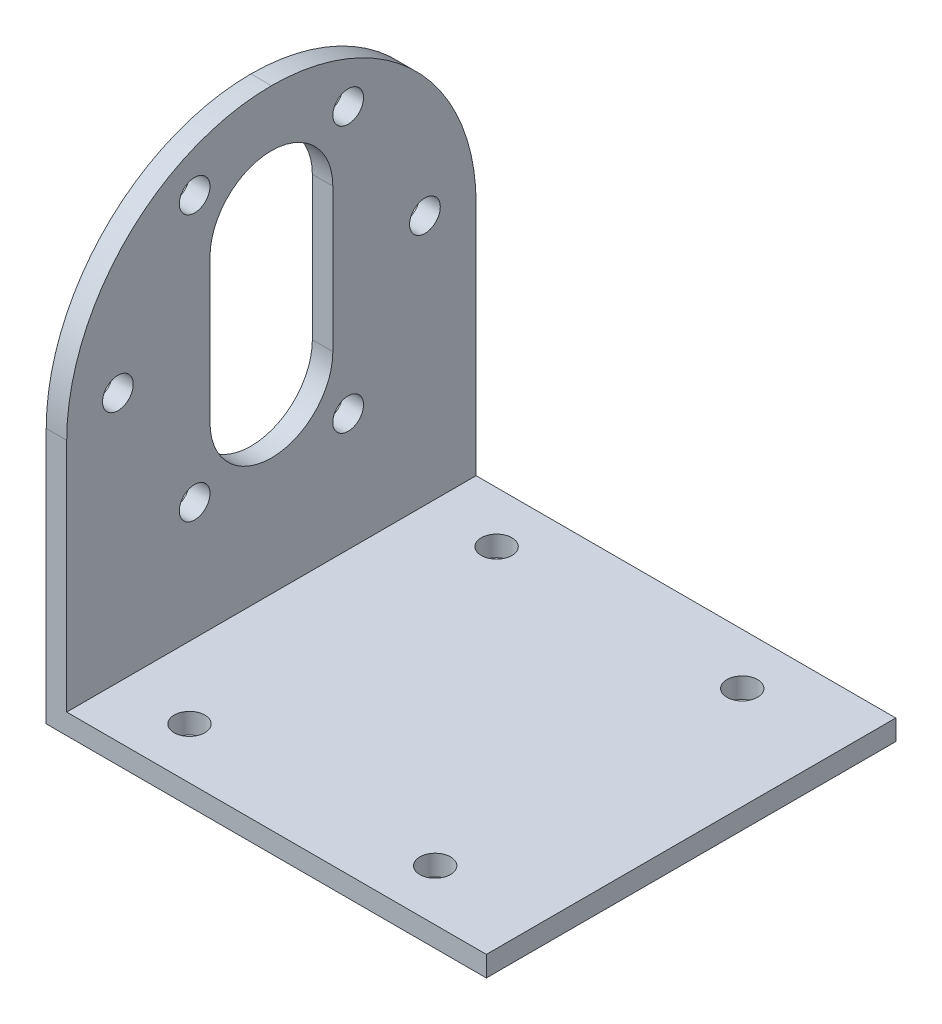
ISO-10303-21;
HEADER;
FILE_DESCRIPTION(('STEP AP214'),'2;1');
FILE_NAME('part.step','',(''),(''),'','','');
FILE_SCHEMA(('AUTOMOTIVE_DESIGN { 1 0 10303 214 1 1 1 1 }'));
ENDSEC;
DATA;
#1=APPLICATION_CONTEXT('core data for automotive mechanical design processes');
#2=APPLICATION_PROTOCOL_DEFINITION('international standard','automotive_design',2000,#1);
#3=PRODUCT_CONTEXT('',#1,'mechanical');
#4=PRODUCT('Part','Part','',(#3));
#5=PRODUCT_RELATED_PRODUCT_CATEGORY('part','',(#4));
#6=PRODUCT_DEFINITION_FORMATION('','',#4);
#7=PRODUCT_DEFINITION_CONTEXT('part definition',#1,'design');
#8=PRODUCT_DEFINITION('design','',#6,#7);
#9=PRODUCT_DEFINITION_SHAPE('','',#8);
#10=(LENGTH_UNIT() NAMED_UNIT(*) SI_UNIT(.MILLI.,.METRE.));
#11=(NAMED_UNIT(*) PLANE_ANGLE_UNIT() SI_UNIT($,.RADIAN.));
#12=(NAMED_UNIT(*) SI_UNIT($,.STERADIAN.) SOLID_ANGLE_UNIT());
#13=UNCERTAINTY_MEASURE_WITH_UNIT(LENGTH_MEASURE(1.E-05),#10,'distance_accuracy_value','');
#14=(GEOMETRIC_REPRESENTATION_CONTEXT(3) GLOBAL_UNCERTAINTY_ASSIGNED_CONTEXT((#13)) GLOBAL_UNIT_ASSIGNED_CONTEXT((#10,
#11,#12)) REPRESENTATION_CONTEXT('',''));
#15=CARTESIAN_POINT('',(0.,0.,0.));
#16=DIRECTION('',(0.,0.,1.));
#17=DIRECTION('',(1.,0.,0.));
#18=AXIS2_PLACEMENT_3D('',#15,#16,#17);
#19=CARTESIAN_POINT('',(0.,-2.,40.));
#20=DIRECTION('',(0.,1.,0.));
#21=DIRECTION('',(0.,0.,1.));
#22=AXIS2_PLACEMENT_3D('',#19,#20,#21);
#23=PLANE('',#22);
#24=CARTESIAN_POINT('',(6.99999999999999,-2.,5.));
#25=DIRECTION('',(0.,1.,0.));
#26=DIRECTION('',(0.,0.,1.));
#27=AXIS2_PLACEMENT_3D('',#24,#25,#26);
#28=CIRCLE('',#27,1.5);
#29=CARTESIAN_POINT('',(6.99999999999999,-2.,6.50000000000001));
#30=VERTEX_POINT('',#29);
#31=EDGE_CURVE('E368',#30,#30,#28,.T.);
#32=ORIENTED_EDGE('',*,*,#31,.T.);
#33=EDGE_LOOP('',(#32));
#34=FACE_BOUND('',#33,.T.);
#35=CARTESIAN_POINT('',(31.,-2.,5.));
#36=DIRECTION('',(0.,1.,0.));
#37=DIRECTION('',(0.,0.,1.));
#38=AXIS2_PLACEMENT_3D('',#35,#36,#37);
#39=CIRCLE('',#38,1.5);
#40=CARTESIAN_POINT('',(31.,-2.,6.49999999999999));
#41=VERTEX_POINT('',#40);
#42=EDGE_CURVE('E374',#41,#41,#39,.T.);
#43=ORIENTED_EDGE('',*,*,#42,.T.);
#44=EDGE_LOOP('',(#43));
#45=FACE_BOUND('',#44,.T.);
#46=CARTESIAN_POINT('',(31.,-2.,35.));
#47=DIRECTION('',(0.,1.,0.));
#48=DIRECTION('',(0.,0.,1.));
#49=AXIS2_PLACEMENT_3D('',#46,#47,#48);
#50=CIRCLE('',#49,1.5);
#51=CARTESIAN_POINT('',(31.,-2.,36.5));
#52=VERTEX_POINT('',#51);
#53=EDGE_CURVE('E363',#52,#52,#50,.T.);
#54=ORIENTED_EDGE('',*,*,#53,.T.);
#55=EDGE_LOOP('',(#54));
#56=FACE_BOUND('',#55,.T.);
#57=CARTESIAN_POINT('',(7.,-2.,35.));
#58=DIRECTION('',(0.,1.,0.));
#59=DIRECTION('',(0.,0.,1.));
#60=AXIS2_PLACEMENT_3D('',#57,#58,#59);
#61=CIRCLE('',#60,1.5);
#62=CARTESIAN_POINT('',(7.,-2.,36.5));
#63=VERTEX_POINT('',#62);
#64=EDGE_CURVE('E357',#63,#63,#61,.T.);
#65=ORIENTED_EDGE('',*,*,#64,.T.);
#66=EDGE_LOOP('',(#65));
#67=FACE_BOUND('',#66,.T.);
#68=DIRECTION('',(1.,0.,0.));
#69=VECTOR('',#68,1.);
#70=CARTESIAN_POINT('',(0.,-2.,0.));
#71=LINE('',#70,#69);
#72=CARTESIAN_POINT('',(-2.,-2.,0.));
#73=VERTEX_POINT('',#72);
#74=CARTESIAN_POINT('',(41.,-2.,0.));
#75=VERTEX_POINT('',#74);
#76=EDGE_CURVE('E188',#73,#75,#71,.T.);
#77=ORIENTED_EDGE('',*,*,#76,.T.);
#78=DIRECTION('',(0.,0.,-1.));
#79=VECTOR('',#78,1.);
#80=CARTESIAN_POINT('',(41.,-2.,40.));
#81=LINE('',#80,#79);
#82=CARTESIAN_POINT('',(41.,-2.,40.));
#83=VERTEX_POINT('',#82);
#84=EDGE_CURVE('E221',#83,#75,#81,.T.);
#85=ORIENTED_EDGE('',*,*,#84,.F.);
#86=DIRECTION('',(1.,0.,0.));
#87=VECTOR('',#86,1.);
#88=CARTESIAN_POINT('',(0.,-2.,40.));
#89=LINE('',#88,#87);
#90=CARTESIAN_POINT('',(-2.,-2.,40.));
#91=VERTEX_POINT('',#90);
#92=EDGE_CURVE('E189',#91,#83,#89,.T.);
#93=ORIENTED_EDGE('',*,*,#92,.F.);
#94=DIRECTION('',(0.,0.,-1.));
#95=VECTOR('',#94,1.);
#96=CARTESIAN_POINT('',(-2.,-2.,40.));
#97=LINE('',#96,#95);
#98=EDGE_CURVE('E202',#91,#73,#97,.T.);
#99=ORIENTED_EDGE('',*,*,#98,.T.);
#100=EDGE_LOOP('',(#77,#85,#93,#99));
#101=FACE_BOUND('',#100,.T.);
#102=ADVANCED_FACE('F34',(#34,#45,#56,#67,#101),#23,.F.);
#103=CARTESIAN_POINT('',(41.,0.,40.));
#104=DIRECTION('',(1.,0.,0.));
#105=DIRECTION('',(0.,0.,-1.));
#106=AXIS2_PLACEMENT_3D('',#103,#104,#105);
#107=PLANE('',#106);
#108=DIRECTION('',(0.,-1.,0.));
#109=VECTOR('',#108,1.);
#110=CARTESIAN_POINT('',(41.,0.,0.));
#111=LINE('',#110,#109);
#112=CARTESIAN_POINT('',(41.,0.,0.));
#113=VERTEX_POINT('',#112);
#114=EDGE_CURVE('E205',#113,#75,#111,.T.);
#115=ORIENTED_EDGE('',*,*,#114,.F.);
#116=DIRECTION('',(0.,0.,-1.));
#117=VECTOR('',#116,1.);
#118=CARTESIAN_POINT('',(41.,0.,40.));
#119=LINE('',#118,#117);
#120=CARTESIAN_POINT('',(41.,0.,40.));
#121=VERTEX_POINT('',#120);
#122=EDGE_CURVE('E219',#121,#113,#119,.T.);
#123=ORIENTED_EDGE('',*,*,#122,.F.);
#124=DIRECTION('',(0.,-1.,0.));
#125=VECTOR('',#124,1.);
#126=CARTESIAN_POINT('',(41.,0.,40.));
#127=LINE('',#126,#125);
#128=EDGE_CURVE('E191',#121,#83,#127,.T.);
#129=ORIENTED_EDGE('',*,*,#128,.T.);
#130=ORIENTED_EDGE('',*,*,#84,.T.);
#131=EDGE_LOOP('',(#115,#123,#129,#130));
#132=FACE_BOUND('',#131,.T.);
#133=ADVANCED_FACE('F266',(#132),#107,.T.);
#134=CARTESIAN_POINT('',(0.,0.,40.));
#135=DIRECTION('',(0.,1.,0.));
#136=DIRECTION('',(0.,0.,1.));
#137=AXIS2_PLACEMENT_3D('',#134,#135,#136);
#138=PLANE('',#137);
#139=CARTESIAN_POINT('',(6.99999999999999,0.,5.));
#140=DIRECTION('',(0.,1.,0.));
#141=DIRECTION('',(0.,0.,1.));
#142=AXIS2_PLACEMENT_3D('',#139,#140,#141);
#143=CIRCLE('',#142,1.5);
#144=CARTESIAN_POINT('',(6.99999999999999,0.,6.50000000000001));
#145=VERTEX_POINT('',#144);
#146=EDGE_CURVE('E365',#145,#145,#143,.T.);
#147=ORIENTED_EDGE('',*,*,#146,.F.);
#148=EDGE_LOOP('',(#147));
#149=FACE_BOUND('',#148,.T.);
#150=CARTESIAN_POINT('',(31.,0.,5.));
#151=DIRECTION('',(0.,1.,0.));
#152=DIRECTION('',(0.,0.,1.));
#153=AXIS2_PLACEMENT_3D('',#150,#151,#152);
#154=CIRCLE('',#153,1.5);
#155=CARTESIAN_POINT('',(31.,0.,6.49999999999999));
#156=VERTEX_POINT('',#155);
#157=EDGE_CURVE('E371',#156,#156,#154,.T.);
#158=ORIENTED_EDGE('',*,*,#157,.F.);
#159=EDGE_LOOP('',(#158));
#160=FACE_BOUND('',#159,.T.);
#161=CARTESIAN_POINT('',(31.,0.,35.));
#162=DIRECTION('',(0.,1.,0.));
#163=DIRECTION('',(0.,0.,1.));
#164=AXIS2_PLACEMENT_3D('',#161,#162,#163);
#165=CIRCLE('',#164,1.5);
#166=CARTESIAN_POINT('',(31.,0.,36.5));
#167=VERTEX_POINT('',#166);
#168=EDGE_CURVE('E377',#167,#167,#165,.T.);
#169=ORIENTED_EDGE('',*,*,#168,.F.);
#170=EDGE_LOOP('',(#169));
#171=FACE_BOUND('',#170,.T.);
#172=CARTESIAN_POINT('',(7.,0.,35.));
#173=DIRECTION('',(0.,1.,0.));
#174=DIRECTION('',(0.,0.,1.));
#175=AXIS2_PLACEMENT_3D('',#172,#173,#174);
#176=CIRCLE('',#175,1.5);
#177=CARTESIAN_POINT('',(7.,0.,36.5));
#178=VERTEX_POINT('',#177);
#179=EDGE_CURVE('E359',#178,#178,#176,.T.);
#180=ORIENTED_EDGE('',*,*,#179,.F.);
#181=EDGE_LOOP('',(#180));
#182=FACE_BOUND('',#181,.T.);
#183=DIRECTION('',(1.,0.,0.));
#184=VECTOR('',#183,1.);
#185=CARTESIAN_POINT('',(0.,0.,0.));
#186=LINE('',#185,#184);
#187=CARTESIAN_POINT('',(0.,0.,0.));
#188=VERTEX_POINT('',#187);
#189=EDGE_CURVE('E208',#188,#113,#186,.T.);
#190=ORIENTED_EDGE('',*,*,#189,.F.);
#191=DIRECTION('',(0.,0.,-1.));
#192=VECTOR('',#191,1.);
#193=CARTESIAN_POINT('',(0.,0.,40.));
#194=LINE('',#193,#192);
#195=CARTESIAN_POINT('',(0.,0.,40.));
#196=VERTEX_POINT('',#195);
#197=EDGE_CURVE('E216',#196,#188,#194,.T.);
#198=ORIENTED_EDGE('',*,*,#197,.F.);
#199=DIRECTION('',(1.,0.,0.));
#200=VECTOR('',#199,1.);
#201=CARTESIAN_POINT('',(0.,0.,40.));
#202=LINE('',#201,#200);
#203=EDGE_CURVE('E195',#196,#121,#202,.T.);
#204=ORIENTED_EDGE('',*,*,#203,.T.);
#205=ORIENTED_EDGE('',*,*,#122,.T.);
#206=EDGE_LOOP('',(#190,#198,#204,#205));
#207=FACE_BOUND('',#206,.T.);
#208=ADVANCED_FACE('F257',(#149,#160,#171,#182,#207),#138,.T.);
#209=CARTESIAN_POINT('',(0.,0.,40.));
#210=DIRECTION('',(1.,0.,0.));
#211=DIRECTION('',(0.,0.,-1.));
#212=AXIS2_PLACEMENT_3D('',#209,#210,#211);
#213=PLANE('',#212);
#214=CARTESIAN_POINT('',(0.,31.4999999999998,20.));
#215=DIRECTION('',(1.,0.,0.));
#216=DIRECTION('',(0.,0.,-1.));
#217=AXIS2_PLACEMENT_3D('',#214,#215,#216);
#218=CIRCLE('',#217,6.);
#219=CARTESIAN_POINT('',(0.,31.4999999999998,14.));
#220=VERTEX_POINT('',#219);
#221=CARTESIAN_POINT('',(0.,31.4999999999998,26.));
#222=VERTEX_POINT('',#221);
#223=EDGE_CURVE('E150',#220,#222,#218,.T.);
#224=ORIENTED_EDGE('',*,*,#223,.F.);
#225=DIRECTION('',(0.,1.,0.));
#226=VECTOR('',#225,1.);
#227=CARTESIAN_POINT('',(0.,0.,14.));
#228=LINE('',#227,#226);
#229=CARTESIAN_POINT('',(0.,17.4999999999998,14.));
#230=VERTEX_POINT('',#229);
#231=EDGE_CURVE('E143',#230,#220,#228,.T.);
#232=ORIENTED_EDGE('',*,*,#231,.F.);
#233=CARTESIAN_POINT('',(0.,17.4999999999998,20.));
#234=DIRECTION('',(1.,0.,0.));
#235=DIRECTION('',(0.,0.,-1.));
#236=AXIS2_PLACEMENT_3D('',#233,#234,#235);
#237=CIRCLE('',#236,6.);
#238=CARTESIAN_POINT('',(0.,17.4999999999998,26.));
#239=VERTEX_POINT('',#238);
#240=EDGE_CURVE('E123',#239,#230,#237,.T.);
#241=ORIENTED_EDGE('',*,*,#240,.F.);
#242=DIRECTION('',(0.,-1.,0.));
#243=VECTOR('',#242,1.);
#244=CARTESIAN_POINT('',(0.,0.,26.));
#245=LINE('',#244,#243);
#246=EDGE_CURVE('E148',#222,#239,#245,.T.);
#247=ORIENTED_EDGE('',*,*,#246,.F.);
#248=EDGE_LOOP('',(#224,#232,#241,#247));
#249=FACE_BOUND('',#248,.T.);
#250=CARTESIAN_POINT('',(0.,24.5,35.));
#251=DIRECTION('',(1.,0.,0.));
#252=DIRECTION('',(0.,0.,-1.));
#253=AXIS2_PLACEMENT_3D('',#250,#251,#252);
#254=CIRCLE('',#253,1.5);
#255=CARTESIAN_POINT('',(0.,24.5,33.5));
#256=VERTEX_POINT('',#255);
#257=EDGE_CURVE('E185',#256,#256,#254,.T.);
#258=ORIENTED_EDGE('',*,*,#257,.F.);
#259=EDGE_LOOP('',(#258));
#260=FACE_BOUND('',#259,.T.);
#261=CARTESIAN_POINT('',(0.,37.4903810567667,27.4999999999998));
#262=DIRECTION('',(1.,0.,0.));
#263=DIRECTION('',(0.,0.,-1.));
#264=AXIS2_PLACEMENT_3D('',#261,#262,#263);
#265=CIRCLE('',#264,1.5);
#266=CARTESIAN_POINT('',(0.,37.4903810567667,25.9999999999998));
#267=VERTEX_POINT('',#266);
#268=EDGE_CURVE('E182',#267,#267,#265,.T.);
#269=ORIENTED_EDGE('',*,*,#268,.F.);
#270=EDGE_LOOP('',(#269));
#271=FACE_BOUND('',#270,.T.);
#272=CARTESIAN_POINT('',(0.,37.4903810567666,12.4999999999996));
#273=DIRECTION('',(1.,0.,0.));
#274=DIRECTION('',(0.,0.,-1.));
#275=AXIS2_PLACEMENT_3D('',#272,#273,#274);
#276=CIRCLE('',#275,1.5);
#277=CARTESIAN_POINT('',(0.,37.4903810567666,10.9999999999996));
#278=VERTEX_POINT('',#277);
#279=EDGE_CURVE('E179',#278,#278,#276,.T.);
#280=ORIENTED_EDGE('',*,*,#279,.F.);
#281=EDGE_LOOP('',(#280));
#282=FACE_BOUND('',#281,.T.);
#283=CARTESIAN_POINT('',(0.,24.4999999999998,4.99999999999959));
#284=DIRECTION('',(1.,0.,0.));
#285=DIRECTION('',(0.,0.,-1.));
#286=AXIS2_PLACEMENT_3D('',#283,#284,#285);
#287=CIRCLE('',#286,1.5);
#288=CARTESIAN_POINT('',(0.,24.4999999999998,3.49999999999959));
#289=VERTEX_POINT('',#288);
#290=EDGE_CURVE('E176',#289,#289,#287,.T.);
#291=ORIENTED_EDGE('',*,*,#290,.F.);
#292=EDGE_LOOP('',(#291));
#293=FACE_BOUND('',#292,.T.);
#294=CARTESIAN_POINT('',(0.,11.5096189432331,12.4999999999998));
#295=DIRECTION('',(1.,0.,0.));
#296=DIRECTION('',(0.,0.,-1.));
#297=AXIS2_PLACEMENT_3D('',#294,#295,#296);
#298=CIRCLE('',#297,1.50000000000001);
#299=CARTESIAN_POINT('',(0.,11.5096189432331,10.9999999999998));
#300=VERTEX_POINT('',#299);
#301=EDGE_CURVE('E173',#300,#300,#298,.T.);
#302=ORIENTED_EDGE('',*,*,#301,.F.);
#303=EDGE_LOOP('',(#302));
#304=FACE_BOUND('',#303,.T.);
#305=CARTESIAN_POINT('',(0.,11.5096189432332,27.5));
#306=DIRECTION('',(1.,0.,0.));
#307=DIRECTION('',(0.,0.,-1.));
#308=AXIS2_PLACEMENT_3D('',#305,#306,#307);
#309=CIRCLE('',#308,1.5);
#310=CARTESIAN_POINT('',(0.,11.5096189432332,26.));
#311=VERTEX_POINT('',#310);
#312=EDGE_CURVE('E155',#311,#311,#309,.T.);
#313=ORIENTED_EDGE('',*,*,#312,.F.);
#314=EDGE_LOOP('',(#313));
#315=FACE_BOUND('',#314,.T.);
#316=CARTESIAN_POINT('',(0.,23.,20.));
#317=DIRECTION('',(1.,0.,0.));
#318=DIRECTION('',(0.,0.,-1.));
#319=AXIS2_PLACEMENT_3D('',#316,#317,#318);
#320=CIRCLE('',#319,20.);
#321=CARTESIAN_POINT('',(0.,23.,0.));
#322=VERTEX_POINT('',#321);
#323=CARTESIAN_POINT('',(0.,43.,20.));
#324=VERTEX_POINT('',#323);
#325=EDGE_CURVE('E223',#322,#324,#320,.T.);
#326=ORIENTED_EDGE('',*,*,#325,.T.);
#327=CARTESIAN_POINT('',(0.,23.,20.));
#328=DIRECTION('',(1.,0.,0.));
#329=DIRECTION('',(0.,0.,-1.));
#330=AXIS2_PLACEMENT_3D('',#327,#328,#329);
#331=CIRCLE('',#330,20.);
#332=CARTESIAN_POINT('',(0.,23.,40.));
#333=VERTEX_POINT('',#332);
#334=EDGE_CURVE('E225',#324,#333,#331,.T.);
#335=ORIENTED_EDGE('',*,*,#334,.T.);
#336=DIRECTION('',(0.,-1.,0.));
#337=VECTOR('',#336,1.);
#338=CARTESIAN_POINT('',(0.,0.,40.));
#339=LINE('',#338,#337);
#340=EDGE_CURVE('E198',#333,#196,#339,.T.);
#341=ORIENTED_EDGE('',*,*,#340,.T.);
#342=ORIENTED_EDGE('',*,*,#197,.T.);
#343=DIRECTION('',(0.,-1.,0.));
#344=VECTOR('',#343,1.);
#345=CARTESIAN_POINT('',(0.,0.,0.));
#346=LINE('',#345,#344);
#347=EDGE_CURVE('E211',#322,#188,#346,.T.);
#348=ORIENTED_EDGE('',*,*,#347,.F.);
#349=EDGE_LOOP('',(#326,#335,#341,#342,#348));
#350=FACE_BOUND('',#349,.T.);
#351=ADVANCED_FACE('F248',(#249,#260,#271,#282,#293,#304,#315,#350),#213,.T.);
#352=CARTESIAN_POINT('',(-2.,0.,40.));
#353=DIRECTION('',(1.,0.,0.));
#354=DIRECTION('',(0.,0.,-1.));
#355=AXIS2_PLACEMENT_3D('',#352,#353,#354);
#356=PLANE('',#355);
#357=DIRECTION('',(0.,-1.,0.));
#358=VECTOR('',#357,1.);
#359=CARTESIAN_POINT('',(-2.,31.4999999999998,14.));
#360=LINE('',#359,#358);
#361=CARTESIAN_POINT('',(-2.,31.4999999999998,14.));
#362=VERTEX_POINT('',#361);
#363=CARTESIAN_POINT('',(-2.,17.4999999999998,14.));
#364=VERTEX_POINT('',#363);
#365=EDGE_CURVE('E129',#362,#364,#360,.T.);
#366=ORIENTED_EDGE('',*,*,#365,.F.);
#367=CARTESIAN_POINT('',(-2.,31.4999999999998,20.));
#368=DIRECTION('',(-1.,0.,0.));
#369=DIRECTION('',(0.,0.,1.));
#370=AXIS2_PLACEMENT_3D('',#367,#368,#369);
#371=CIRCLE('',#370,6.);
#372=CARTESIAN_POINT('',(-2.,31.4999999999998,26.));
#373=VERTEX_POINT('',#372);
#374=EDGE_CURVE('E58',#373,#362,#371,.T.);
#375=ORIENTED_EDGE('',*,*,#374,.F.);
#376=DIRECTION('',(0.,1.,0.));
#377=VECTOR('',#376,1.);
#378=CARTESIAN_POINT('',(-2.,31.4999999999998,26.));
#379=LINE('',#378,#377);
#380=CARTESIAN_POINT('',(-2.,17.4999999999998,26.));
#381=VERTEX_POINT('',#380);
#382=EDGE_CURVE('E136',#381,#373,#379,.T.);
#383=ORIENTED_EDGE('',*,*,#382,.F.);
#384=CARTESIAN_POINT('',(-2.,17.4999999999998,20.));
#385=DIRECTION('',(-1.,0.,0.));
#386=DIRECTION('',(0.,0.,1.));
#387=AXIS2_PLACEMENT_3D('',#384,#385,#386);
#388=CIRCLE('',#387,6.);
#389=EDGE_CURVE('E120',#364,#381,#388,.T.);
#390=ORIENTED_EDGE('',*,*,#389,.F.);
#391=EDGE_LOOP('',(#366,#375,#383,#390));
#392=FACE_BOUND('',#391,.T.);
#393=CARTESIAN_POINT('',(-2.,24.5,35.));
#394=DIRECTION('',(-1.,0.,0.));
#395=DIRECTION('',(0.,0.,1.));
#396=AXIS2_PLACEMENT_3D('',#393,#394,#395);
#397=CIRCLE('',#396,1.5);
#398=CARTESIAN_POINT('',(-2.,24.5,36.5));
#399=VERTEX_POINT('',#398);
#400=EDGE_CURVE('E152',#399,#399,#397,.T.);
#401=ORIENTED_EDGE('',*,*,#400,.F.);
#402=EDGE_LOOP('',(#401));
#403=FACE_BOUND('',#402,.T.);
#404=CARTESIAN_POINT('',(-2.,37.4903810567667,27.4999999999998));
#405=DIRECTION('',(-1.,0.,0.));
#406=DIRECTION('',(0.,0.,1.));
#407=AXIS2_PLACEMENT_3D('',#404,#405,#406);
#408=CIRCLE('',#407,1.5);
#409=CARTESIAN_POINT('',(-2.,37.4903810567667,28.9999999999998));
#410=VERTEX_POINT('',#409);
#411=EDGE_CURVE('E157',#410,#410,#408,.T.);
#412=ORIENTED_EDGE('',*,*,#411,.F.);
#413=EDGE_LOOP('',(#412));
#414=FACE_BOUND('',#413,.T.);
#415=CARTESIAN_POINT('',(-2.,37.4903810567666,12.4999999999996));
#416=DIRECTION('',(-1.,0.,0.));
#417=DIRECTION('',(0.,0.,1.));
#418=AXIS2_PLACEMENT_3D('',#415,#416,#417);
#419=CIRCLE('',#418,1.5);
#420=CARTESIAN_POINT('',(-2.,37.4903810567666,13.9999999999996));
#421=VERTEX_POINT('',#420);
#422=EDGE_CURVE('E160',#421,#421,#419,.T.);
#423=ORIENTED_EDGE('',*,*,#422,.F.);
#424=EDGE_LOOP('',(#423));
#425=FACE_BOUND('',#424,.T.);
#426=CARTESIAN_POINT('',(-2.,24.4999999999998,4.99999999999959));
#427=DIRECTION('',(-1.,0.,0.));
#428=DIRECTION('',(0.,0.,1.));
#429=AXIS2_PLACEMENT_3D('',#426,#427,#428);
#430=CIRCLE('',#429,1.5);
#431=CARTESIAN_POINT('',(-2.,24.4999999999998,6.49999999999959));
#432=VERTEX_POINT('',#431);
#433=EDGE_CURVE('E166',#432,#432,#430,.T.);
#434=ORIENTED_EDGE('',*,*,#433,.F.);
#435=EDGE_LOOP('',(#434));
#436=FACE_BOUND('',#435,.T.);
#437=CARTESIAN_POINT('',(-2.,11.5096189432331,12.4999999999998));
#438=DIRECTION('',(-1.,0.,0.));
#439=DIRECTION('',(0.,0.,1.));
#440=AXIS2_PLACEMENT_3D('',#437,#438,#439);
#441=CIRCLE('',#440,1.50000000000001);
#442=CARTESIAN_POINT('',(-2.,11.5096189432331,13.9999999999998));
#443=VERTEX_POINT('',#442);
#444=EDGE_CURVE('E163',#443,#443,#441,.T.);
#445=ORIENTED_EDGE('',*,*,#444,.F.);
#446=EDGE_LOOP('',(#445));
#447=FACE_BOUND('',#446,.T.);
#448=CARTESIAN_POINT('',(-2.,11.5096189432332,27.5));
#449=DIRECTION('',(-1.,0.,0.));
#450=DIRECTION('',(0.,0.,1.));
#451=AXIS2_PLACEMENT_3D('',#448,#449,#450);
#452=CIRCLE('',#451,1.5);
#453=CARTESIAN_POINT('',(-2.,11.5096189432332,29.));
#454=VERTEX_POINT('',#453);
#455=EDGE_CURVE('E156',#454,#454,#452,.T.);
#456=ORIENTED_EDGE('',*,*,#455,.F.);
#457=EDGE_LOOP('',(#456));
#458=FACE_BOUND('',#457,.T.);
#459=DIRECTION('',(0.,1.,0.));
#460=VECTOR('',#459,1.);
#461=CARTESIAN_POINT('',(-2.,0.,40.));
#462=LINE('',#461,#460);
#463=CARTESIAN_POINT('',(-2.,23.,40.));
#464=VERTEX_POINT('',#463);
#465=EDGE_CURVE('E200',#464,#91,#462,.F.);
#466=ORIENTED_EDGE('',*,*,#465,.F.);
#467=CARTESIAN_POINT('',(-2.,23.,20.));
#468=DIRECTION('',(1.,0.,0.));
#469=DIRECTION('',(0.,0.,-1.));
#470=AXIS2_PLACEMENT_3D('',#467,#468,#469);
#471=CIRCLE('',#470,20.);
#472=CARTESIAN_POINT('',(-2.,43.,20.));
#473=VERTEX_POINT('',#472);
#474=EDGE_CURVE('E43',#464,#473,#471,.F.);
#475=ORIENTED_EDGE('',*,*,#474,.T.);
#476=CARTESIAN_POINT('',(-2.,23.,20.));
#477=DIRECTION('',(1.,0.,0.));
#478=DIRECTION('',(0.,0.,-1.));
#479=AXIS2_PLACEMENT_3D('',#476,#477,#478);
#480=CIRCLE('',#479,20.);
#481=CARTESIAN_POINT('',(-2.,23.,0.));
#482=VERTEX_POINT('',#481);
#483=EDGE_CURVE('E230',#473,#482,#480,.F.);
#484=ORIENTED_EDGE('',*,*,#483,.T.);
#485=DIRECTION('',(0.,1.,0.));
#486=VECTOR('',#485,1.);
#487=CARTESIAN_POINT('',(-2.,0.,0.));
#488=LINE('',#487,#486);
#489=EDGE_CURVE('E192',#482,#73,#488,.F.);
#490=ORIENTED_EDGE('',*,*,#489,.T.);
#491=ORIENTED_EDGE('',*,*,#98,.F.);
#492=EDGE_LOOP('',(#466,#475,#484,#490,#491));
#493=FACE_BOUND('',#492,.T.);
#494=ADVANCED_FACE('F133',(#392,#403,#414,#425,#436,#447,#458,#493),#356,.F.);
#495=CARTESIAN_POINT('',(0.,0.,40.));
#496=DIRECTION('',(0.,0.,-1.));
#497=DIRECTION('',(-1.,0.,0.));
#498=AXIS2_PLACEMENT_3D('',#495,#496,#497);
#499=PLANE('',#498);
#500=ORIENTED_EDGE('',*,*,#340,.F.);
#501=DIRECTION('',(1.,0.,0.));
#502=VECTOR('',#501,1.);
#503=CARTESIAN_POINT('',(-2.,23.,40.));
#504=LINE('',#503,#502);
#505=EDGE_CURVE('E227',#333,#464,#504,.F.);
#506=ORIENTED_EDGE('',*,*,#505,.T.);
#507=ORIENTED_EDGE('',*,*,#465,.T.);
#508=ORIENTED_EDGE('',*,*,#92,.T.);
#509=ORIENTED_EDGE('',*,*,#128,.F.);
#510=ORIENTED_EDGE('',*,*,#203,.F.);
#511=EDGE_LOOP('',(#500,#506,#507,#508,#509,#510));
#512=FACE_BOUND('',#511,.T.);
#513=ADVANCED_FACE('F253',(#512),#499,.F.);
#514=CARTESIAN_POINT('',(0.,0.,0.));
#515=DIRECTION('',(0.,0.,-1.));
#516=DIRECTION('',(-1.,0.,0.));
#517=AXIS2_PLACEMENT_3D('',#514,#515,#516);
#518=PLANE('',#517);
#519=ORIENTED_EDGE('',*,*,#489,.F.);
#520=DIRECTION('',(1.,0.,0.));
#521=VECTOR('',#520,1.);
#522=CARTESIAN_POINT('',(0.,23.,0.));
#523=LINE('',#522,#521);
#524=EDGE_CURVE('E11',#482,#322,#523,.T.);
#525=ORIENTED_EDGE('',*,*,#524,.T.);
#526=ORIENTED_EDGE('',*,*,#347,.T.);
#527=ORIENTED_EDGE('',*,*,#189,.T.);
#528=ORIENTED_EDGE('',*,*,#114,.T.);
#529=ORIENTED_EDGE('',*,*,#76,.F.);
#530=EDGE_LOOP('',(#519,#525,#526,#527,#528,#529));
#531=FACE_BOUND('',#530,.T.);
#532=ADVANCED_FACE('F260',(#531),#518,.T.);
#533=CARTESIAN_POINT('',(41.,11.5096189432332,27.5));
#534=DIRECTION('',(-1.,0.,0.));
#535=DIRECTION('',(0.,0.,1.));
#536=AXIS2_PLACEMENT_3D('',#533,#534,#535);
#537=CYLINDRICAL_SURFACE('',#536,1.5);
#538=ORIENTED_EDGE('',*,*,#312,.T.);
#539=EDGE_LOOP('',(#538));
#540=FACE_BOUND('',#539,.T.);
#541=ORIENTED_EDGE('',*,*,#455,.T.);
#542=EDGE_LOOP('',(#541));
#543=FACE_BOUND('',#542,.T.);
#544=ADVANCED_FACE('F302',(#540,#543),#537,.F.);
#545=CARTESIAN_POINT('',(41.,11.5096189432331,12.4999999999998));
#546=DIRECTION('',(-1.,0.,0.));
#547=DIRECTION('',(0.,0.,1.));
#548=AXIS2_PLACEMENT_3D('',#545,#546,#547);
#549=CYLINDRICAL_SURFACE('',#548,1.50000000000001);
#550=ORIENTED_EDGE('',*,*,#301,.T.);
#551=EDGE_LOOP('',(#550));
#552=FACE_BOUND('',#551,.T.);
#553=ORIENTED_EDGE('',*,*,#444,.T.);
#554=EDGE_LOOP('',(#553));
#555=FACE_BOUND('',#554,.T.);
#556=ADVANCED_FACE('F305',(#552,#555),#549,.F.);
#557=CARTESIAN_POINT('',(41.,24.4999999999998,4.99999999999959));
#558=DIRECTION('',(-1.,0.,0.));
#559=DIRECTION('',(0.,0.,1.));
#560=AXIS2_PLACEMENT_3D('',#557,#558,#559);
#561=CYLINDRICAL_SURFACE('',#560,1.5);
#562=ORIENTED_EDGE('',*,*,#290,.T.);
#563=EDGE_LOOP('',(#562));
#564=FACE_BOUND('',#563,.T.);
#565=ORIENTED_EDGE('',*,*,#433,.T.);
#566=EDGE_LOOP('',(#565));
#567=FACE_BOUND('',#566,.T.);
#568=ADVANCED_FACE('F309',(#564,#567),#561,.F.);
#569=CARTESIAN_POINT('',(41.,37.4903810567666,12.4999999999996));
#570=DIRECTION('',(-1.,0.,0.));
#571=DIRECTION('',(0.,0.,1.));
#572=AXIS2_PLACEMENT_3D('',#569,#570,#571);
#573=CYLINDRICAL_SURFACE('',#572,1.5);
#574=ORIENTED_EDGE('',*,*,#279,.T.);
#575=EDGE_LOOP('',(#574));
#576=FACE_BOUND('',#575,.T.);
#577=ORIENTED_EDGE('',*,*,#422,.T.);
#578=EDGE_LOOP('',(#577));
#579=FACE_BOUND('',#578,.T.);
#580=ADVANCED_FACE('F296',(#576,#579),#573,.F.);
#581=CARTESIAN_POINT('',(41.,37.4903810567667,27.4999999999998));
#582=DIRECTION('',(-1.,0.,0.));
#583=DIRECTION('',(0.,0.,1.));
#584=AXIS2_PLACEMENT_3D('',#581,#582,#583);
#585=CYLINDRICAL_SURFACE('',#584,1.5);
#586=ORIENTED_EDGE('',*,*,#268,.T.);
#587=EDGE_LOOP('',(#586));
#588=FACE_BOUND('',#587,.T.);
#589=ORIENTED_EDGE('',*,*,#411,.T.);
#590=EDGE_LOOP('',(#589));
#591=FACE_BOUND('',#590,.T.);
#592=ADVANCED_FACE('F290',(#588,#591),#585,.F.);
#593=CARTESIAN_POINT('',(41.,24.5,35.));
#594=DIRECTION('',(-1.,0.,0.));
#595=DIRECTION('',(0.,0.,1.));
#596=AXIS2_PLACEMENT_3D('',#593,#594,#595);
#597=CYLINDRICAL_SURFACE('',#596,1.5);
#598=ORIENTED_EDGE('',*,*,#257,.T.);
#599=EDGE_LOOP('',(#598));
#600=FACE_BOUND('',#599,.T.);
#601=ORIENTED_EDGE('',*,*,#400,.T.);
#602=EDGE_LOOP('',(#601));
#603=FACE_BOUND('',#602,.T.);
#604=ADVANCED_FACE('F286',(#600,#603),#597,.F.);
#605=CARTESIAN_POINT('',(0.,23.,20.));
#606=DIRECTION('',(1.,0.,0.));
#607=DIRECTION('',(0.,0.,-1.));
#608=AXIS2_PLACEMENT_3D('',#605,#606,#607);
#609=CYLINDRICAL_SURFACE('',#608,20.);
#610=ORIENTED_EDGE('',*,*,#524,.F.);
#611=ORIENTED_EDGE('',*,*,#483,.F.);
#612=DIRECTION('',(1.,0.,0.));
#613=VECTOR('',#612,1.);
#614=CARTESIAN_POINT('',(-2.,43.,20.));
#615=LINE('',#614,#613);
#616=EDGE_CURVE('E38',#324,#473,#615,.F.);
#617=ORIENTED_EDGE('',*,*,#616,.F.);
#618=ORIENTED_EDGE('',*,*,#325,.F.);
#619=EDGE_LOOP('',(#610,#611,#617,#618));
#620=FACE_BOUND('',#619,.T.);
#621=ADVANCED_FACE('F36',(#620),#609,.T.);
#622=CARTESIAN_POINT('',(-2.,23.,20.));
#623=DIRECTION('',(-1.,0.,0.));
#624=DIRECTION('',(0.,0.,1.));
#625=AXIS2_PLACEMENT_3D('',#622,#623,#624);
#626=CYLINDRICAL_SURFACE('',#625,20.);
#627=ORIENTED_EDGE('',*,*,#474,.F.);
#628=ORIENTED_EDGE('',*,*,#505,.F.);
#629=ORIENTED_EDGE('',*,*,#334,.F.);
#630=ORIENTED_EDGE('',*,*,#616,.T.);
#631=EDGE_LOOP('',(#627,#628,#629,#630));
#632=FACE_BOUND('',#631,.T.);
#633=ADVANCED_FACE('F245',(#632),#626,.T.);
#634=CARTESIAN_POINT('',(41.,31.4999999999998,20.));
#635=DIRECTION('',(-1.,0.,0.));
#636=DIRECTION('',(0.,0.,1.));
#637=AXIS2_PLACEMENT_3D('',#634,#635,#636);
#638=CYLINDRICAL_SURFACE('',#637,6.);
#639=ORIENTED_EDGE('',*,*,#223,.T.);
#640=DIRECTION('',(-1.,0.,0.));
#641=VECTOR('',#640,1.);
#642=CARTESIAN_POINT('',(41.,31.4999999999998,26.));
#643=LINE('',#642,#641);
#644=EDGE_CURVE('E141',#222,#373,#643,.T.);
#645=ORIENTED_EDGE('',*,*,#644,.T.);
#646=ORIENTED_EDGE('',*,*,#374,.T.);
#647=DIRECTION('',(-1.,0.,0.));
#648=VECTOR('',#647,1.);
#649=CARTESIAN_POINT('',(41.,31.4999999999998,14.));
#650=LINE('',#649,#648);
#651=EDGE_CURVE('E126',#220,#362,#650,.T.);
#652=ORIENTED_EDGE('',*,*,#651,.F.);
#653=EDGE_LOOP('',(#639,#645,#646,#652));
#654=FACE_BOUND('',#653,.T.);
#655=ADVANCED_FACE('F279',(#654),#638,.F.);
#656=CARTESIAN_POINT('',(41.,31.4999999999998,26.));
#657=DIRECTION('',(0.,0.,1.));
#658=DIRECTION('',(0.,-1.,0.));
#659=AXIS2_PLACEMENT_3D('',#656,#657,#658);
#660=PLANE('',#659);
#661=ORIENTED_EDGE('',*,*,#246,.T.);
#662=DIRECTION('',(-1.,0.,0.));
#663=VECTOR('',#662,1.);
#664=CARTESIAN_POINT('',(41.,17.4999999999998,26.));
#665=LINE('',#664,#663);
#666=EDGE_CURVE('E125',#239,#381,#665,.T.);
#667=ORIENTED_EDGE('',*,*,#666,.T.);
#668=ORIENTED_EDGE('',*,*,#382,.T.);
#669=ORIENTED_EDGE('',*,*,#644,.F.);
#670=EDGE_LOOP('',(#661,#667,#668,#669));
#671=FACE_BOUND('',#670,.T.);
#672=ADVANCED_FACE('F284',(#671),#660,.F.);
#673=CARTESIAN_POINT('',(41.,17.4999999999998,20.));
#674=DIRECTION('',(-1.,0.,0.));
#675=DIRECTION('',(0.,0.,1.));
#676=AXIS2_PLACEMENT_3D('',#673,#674,#675);
#677=CYLINDRICAL_SURFACE('',#676,6.);
#678=ORIENTED_EDGE('',*,*,#240,.T.);
#679=DIRECTION('',(-1.,0.,0.));
#680=VECTOR('',#679,1.);
#681=CARTESIAN_POINT('',(41.,17.4999999999998,14.));
#682=LINE('',#681,#680);
#683=EDGE_CURVE('E50',#230,#364,#682,.T.);
#684=ORIENTED_EDGE('',*,*,#683,.T.);
#685=ORIENTED_EDGE('',*,*,#389,.T.);
#686=ORIENTED_EDGE('',*,*,#666,.F.);
#687=EDGE_LOOP('',(#678,#684,#685,#686));
#688=FACE_BOUND('',#687,.T.);
#689=ADVANCED_FACE('F117',(#688),#677,.F.);
#690=CARTESIAN_POINT('',(41.,31.4999999999998,14.));
#691=DIRECTION('',(0.,0.,-1.));
#692=DIRECTION('',(0.,1.,0.));
#693=AXIS2_PLACEMENT_3D('',#690,#691,#692);
#694=PLANE('',#693);
#695=ORIENTED_EDGE('',*,*,#231,.T.);
#696=ORIENTED_EDGE('',*,*,#651,.T.);
#697=ORIENTED_EDGE('',*,*,#365,.T.);
#698=ORIENTED_EDGE('',*,*,#683,.F.);
#699=EDGE_LOOP('',(#695,#696,#697,#698));
#700=FACE_BOUND('',#699,.T.);
#701=ADVANCED_FACE('F130',(#700),#694,.F.);
#702=CARTESIAN_POINT('',(7.,-2.,35.));
#703=DIRECTION('',(0.,1.,0.));
#704=DIRECTION('',(0.,0.,1.));
#705=AXIS2_PLACEMENT_3D('',#702,#703,#704);
#706=CYLINDRICAL_SURFACE('',#705,1.5);
#707=ORIENTED_EDGE('',*,*,#64,.F.);
#708=EDGE_LOOP('',(#707));
#709=FACE_BOUND('',#708,.T.);
#710=ORIENTED_EDGE('',*,*,#179,.T.);
#711=EDGE_LOOP('',(#710));
#712=FACE_BOUND('',#711,.T.);
#713=ADVANCED_FACE('F389',(#709,#712),#706,.F.);
#714=CARTESIAN_POINT('',(31.,-2.,35.));
#715=DIRECTION('',(0.,1.,0.));
#716=DIRECTION('',(0.,0.,1.));
#717=AXIS2_PLACEMENT_3D('',#714,#715,#716);
#718=CYLINDRICAL_SURFACE('',#717,1.5);
#719=ORIENTED_EDGE('',*,*,#53,.F.);
#720=EDGE_LOOP('',(#719));
#721=FACE_BOUND('',#720,.T.);
#722=ORIENTED_EDGE('',*,*,#168,.T.);
#723=EDGE_LOOP('',(#722));
#724=FACE_BOUND('',#723,.T.);
#725=ADVANCED_FACE('F385',(#721,#724),#718,.F.);
#726=CARTESIAN_POINT('',(31.,-2.,5.));
#727=DIRECTION('',(0.,1.,0.));
#728=DIRECTION('',(0.,0.,1.));
#729=AXIS2_PLACEMENT_3D('',#726,#727,#728);
#730=CYLINDRICAL_SURFACE('',#729,1.5);
#731=ORIENTED_EDGE('',*,*,#42,.F.);
#732=EDGE_LOOP('',(#731));
#733=FACE_BOUND('',#732,.T.);
#734=ORIENTED_EDGE('',*,*,#157,.T.);
#735=EDGE_LOOP('',(#734));
#736=FACE_BOUND('',#735,.T.);
#737=ADVANCED_FACE('F388',(#733,#736),#730,.F.);
#738=CARTESIAN_POINT('',(6.99999999999999,-2.,5.));
#739=DIRECTION('',(0.,1.,0.));
#740=DIRECTION('',(0.,0.,1.));
#741=AXIS2_PLACEMENT_3D('',#738,#739,#740);
#742=CYLINDRICAL_SURFACE('',#741,1.5);
#743=ORIENTED_EDGE('',*,*,#31,.F.);
#744=EDGE_LOOP('',(#743));
#745=FACE_BOUND('',#744,.T.);
#746=ORIENTED_EDGE('',*,*,#146,.T.);
#747=EDGE_LOOP('',(#746));
#748=FACE_BOUND('',#747,.T.);
#749=ADVANCED_FACE('F405',(#745,#748),#742,.F.);
#750=CLOSED_SHELL('',(#102,#133,#208,#351,#494,#513,#532,#544,#556,#568,#580,#592,#604,#621,
#633,#655,#672,#689,#701,#713,#725,#737,#749));
#751=MANIFOLD_SOLID_BREP('B2',#750);
#752=ADVANCED_BREP_SHAPE_REPRESENTATION('',(#18,#751),#14);
#753=SHAPE_DEFINITION_REPRESENTATION(#9,#752);
ENDSEC;
END-ISO-10303-21;
